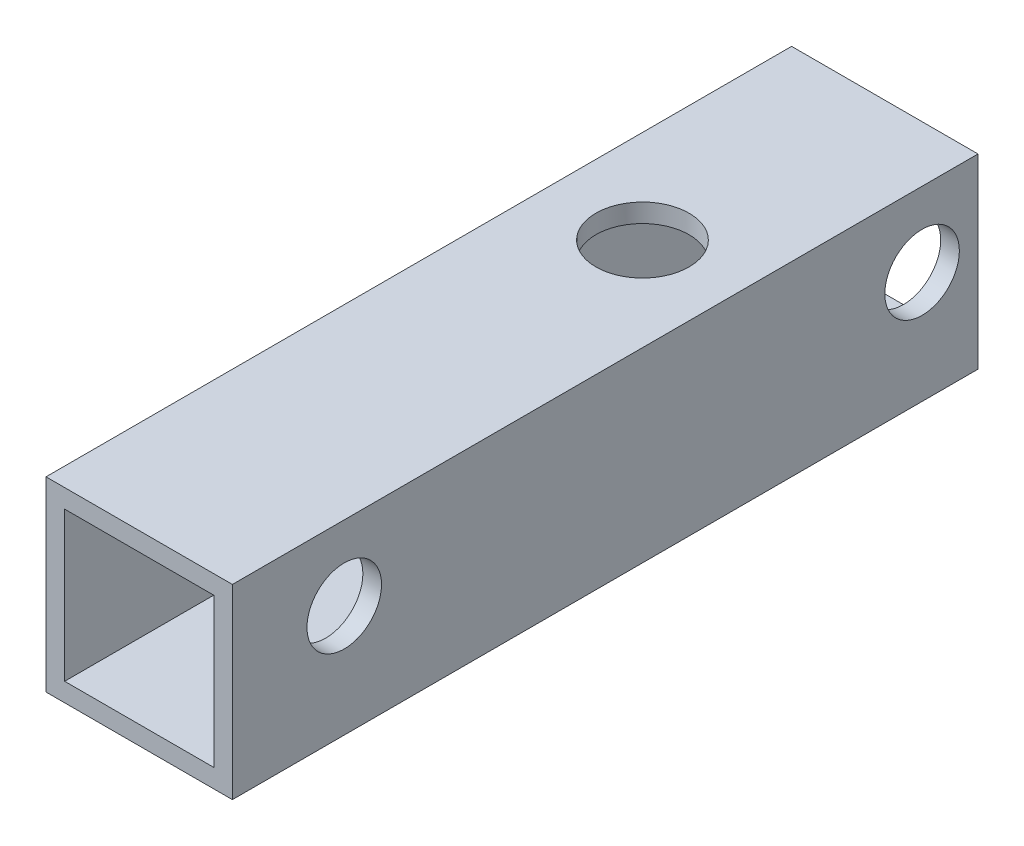
ISO-10303-21;
HEADER;
FILE_DESCRIPTION(('STEP AP214'),'2;1');
FILE_NAME('part.step','',(''),(''),'','','');
FILE_SCHEMA(('AUTOMOTIVE_DESIGN { 1 0 10303 214 1 1 1 1 }'));
ENDSEC;
DATA;
#1=APPLICATION_CONTEXT('core data for automotive mechanical design processes');
#2=APPLICATION_PROTOCOL_DEFINITION('international standard','automotive_design',2000,#1);
#3=PRODUCT_CONTEXT('',#1,'mechanical');
#4=PRODUCT('Part','Part','',(#3));
#5=PRODUCT_RELATED_PRODUCT_CATEGORY('part','',(#4));
#6=PRODUCT_DEFINITION_FORMATION('','',#4);
#7=PRODUCT_DEFINITION_CONTEXT('part definition',#1,'design');
#8=PRODUCT_DEFINITION('design','',#6,#7);
#9=PRODUCT_DEFINITION_SHAPE('','',#8);
#10=(LENGTH_UNIT() NAMED_UNIT(*) SI_UNIT(.MILLI.,.METRE.));
#11=(NAMED_UNIT(*) PLANE_ANGLE_UNIT() SI_UNIT($,.RADIAN.));
#12=(NAMED_UNIT(*) SI_UNIT($,.STERADIAN.) SOLID_ANGLE_UNIT());
#13=UNCERTAINTY_MEASURE_WITH_UNIT(LENGTH_MEASURE(1.E-05),#10,'distance_accuracy_value','');
#14=(GEOMETRIC_REPRESENTATION_CONTEXT(3) GLOBAL_UNCERTAINTY_ASSIGNED_CONTEXT((#13)) GLOBAL_UNIT_ASSIGNED_CONTEXT((#10,
#11,#12)) REPRESENTATION_CONTEXT('',''));
#15=CARTESIAN_POINT('',(0.,0.,0.));
#16=DIRECTION('',(0.,0.,1.));
#17=DIRECTION('',(1.,0.,0.));
#18=AXIS2_PLACEMENT_3D('',#15,#16,#17);
#19=CARTESIAN_POINT('',(-4.99999999999999,5.00000000000002,40.));
#20=DIRECTION('',(0.,0.,1.));
#21=DIRECTION('',(1.,0.,0.));
#22=AXIS2_PLACEMENT_3D('',#19,#20,#21);
#23=PLANE('',#22);
#24=DIRECTION('',(0.,-1.,0.));
#25=VECTOR('',#24,1.);
#26=CARTESIAN_POINT('',(-4.99999999999999,-4.99999999999999,40.));
#27=LINE('',#26,#25);
#28=CARTESIAN_POINT('',(-4.99999999999999,5.00000000000002,40.));
#29=VERTEX_POINT('',#28);
#30=CARTESIAN_POINT('',(-4.99999999999999,-4.99999999999999,40.));
#31=VERTEX_POINT('',#30);
#32=EDGE_CURVE('E138',#29,#31,#27,.T.);
#33=ORIENTED_EDGE('',*,*,#32,.T.);
#34=DIRECTION('',(1.,0.,0.));
#35=VECTOR('',#34,1.);
#36=CARTESIAN_POINT('',(5.00000000000001,-4.99999999999999,40.));
#37=LINE('',#36,#35);
#38=CARTESIAN_POINT('',(5.00000000000001,-4.99999999999999,40.));
#39=VERTEX_POINT('',#38);
#40=EDGE_CURVE('E141',#31,#39,#37,.T.);
#41=ORIENTED_EDGE('',*,*,#40,.T.);
#42=DIRECTION('',(0.,1.,0.));
#43=VECTOR('',#42,1.);
#44=CARTESIAN_POINT('',(5.00000000000001,-4.99999999999999,40.));
#45=LINE('',#44,#43);
#46=CARTESIAN_POINT('',(5.00000000000001,5.00000000000002,40.));
#47=VERTEX_POINT('',#46);
#48=EDGE_CURVE('E144',#39,#47,#45,.T.);
#49=ORIENTED_EDGE('',*,*,#48,.T.);
#50=DIRECTION('',(-1.,0.,0.));
#51=VECTOR('',#50,1.);
#52=CARTESIAN_POINT('',(5.00000000000001,5.00000000000002,40.));
#53=LINE('',#52,#51);
#54=EDGE_CURVE('E146',#47,#29,#53,.T.);
#55=ORIENTED_EDGE('',*,*,#54,.T.);
#56=EDGE_LOOP('',(#33,#41,#49,#55));
#57=FACE_BOUND('',#56,.T.);
#58=DIRECTION('',(1.,0.,0.));
#59=VECTOR('',#58,1.);
#60=CARTESIAN_POINT('',(4.00000000000001,-3.99999999999999,40.));
#61=LINE('',#60,#59);
#62=CARTESIAN_POINT('',(-3.99999999999999,-3.99999999999999,40.));
#63=VERTEX_POINT('',#62);
#64=CARTESIAN_POINT('',(4.00000000000001,-3.99999999999999,40.));
#65=VERTEX_POINT('',#64);
#66=EDGE_CURVE('E108',#63,#65,#61,.T.);
#67=ORIENTED_EDGE('',*,*,#66,.F.);
#68=DIRECTION('',(0.,-1.,0.));
#69=VECTOR('',#68,1.);
#70=CARTESIAN_POINT('',(-3.99999999999999,-3.99999999999999,40.));
#71=LINE('',#70,#69);
#72=CARTESIAN_POINT('',(-3.99999999999999,4.00000000000002,40.));
#73=VERTEX_POINT('',#72);
#74=EDGE_CURVE('E100',#73,#63,#71,.T.);
#75=ORIENTED_EDGE('',*,*,#74,.F.);
#76=DIRECTION('',(-1.,0.,0.));
#77=VECTOR('',#76,1.);
#78=CARTESIAN_POINT('',(4.00000000000001,4.00000000000002,40.));
#79=LINE('',#78,#77);
#80=CARTESIAN_POINT('',(4.00000000000002,4.00000000000002,40.));
#81=VERTEX_POINT('',#80);
#82=EDGE_CURVE('E122',#81,#73,#79,.T.);
#83=ORIENTED_EDGE('',*,*,#82,.F.);
#84=DIRECTION('',(0.,1.,0.));
#85=VECTOR('',#84,1.);
#86=CARTESIAN_POINT('',(4.00000000000001,-3.99999999999999,40.));
#87=LINE('',#86,#85);
#88=EDGE_CURVE('E120',#65,#81,#87,.T.);
#89=ORIENTED_EDGE('',*,*,#88,.F.);
#90=EDGE_LOOP('',(#67,#75,#83,#89));
#91=FACE_BOUND('',#90,.T.);
#92=ADVANCED_FACE('F33',(#57,#91),#23,.T.);
#93=CARTESIAN_POINT('',(-4.99999999999999,5.00000000000002,0.));
#94=DIRECTION('',(0.,0.,1.));
#95=DIRECTION('',(1.,0.,0.));
#96=AXIS2_PLACEMENT_3D('',#93,#94,#95);
#97=PLANE('',#96);
#98=DIRECTION('',(0.,-1.,0.));
#99=VECTOR('',#98,1.);
#100=CARTESIAN_POINT('',(-4.99999999999999,-4.99999999999999,0.));
#101=LINE('',#100,#99);
#102=CARTESIAN_POINT('',(-4.99999999999999,5.00000000000002,0.));
#103=VERTEX_POINT('',#102);
#104=CARTESIAN_POINT('',(-4.99999999999999,-4.99999999999999,0.));
#105=VERTEX_POINT('',#104);
#106=EDGE_CURVE('E116',#103,#105,#101,.T.);
#107=ORIENTED_EDGE('',*,*,#106,.F.);
#108=DIRECTION('',(-1.,0.,0.));
#109=VECTOR('',#108,1.);
#110=CARTESIAN_POINT('',(5.00000000000001,5.00000000000002,0.));
#111=LINE('',#110,#109);
#112=CARTESIAN_POINT('',(5.00000000000001,5.00000000000002,0.));
#113=VERTEX_POINT('',#112);
#114=EDGE_CURVE('E142',#113,#103,#111,.T.);
#115=ORIENTED_EDGE('',*,*,#114,.F.);
#116=DIRECTION('',(0.,1.,0.));
#117=VECTOR('',#116,1.);
#118=CARTESIAN_POINT('',(5.00000000000001,-4.99999999999999,0.));
#119=LINE('',#118,#117);
#120=CARTESIAN_POINT('',(5.00000000000001,-4.99999999999999,0.));
#121=VERTEX_POINT('',#120);
#122=EDGE_CURVE('E153',#121,#113,#119,.T.);
#123=ORIENTED_EDGE('',*,*,#122,.F.);
#124=DIRECTION('',(1.,0.,0.));
#125=VECTOR('',#124,1.);
#126=CARTESIAN_POINT('',(5.00000000000001,-4.99999999999999,0.));
#127=LINE('',#126,#125);
#128=EDGE_CURVE('E151',#105,#121,#127,.T.);
#129=ORIENTED_EDGE('',*,*,#128,.F.);
#130=EDGE_LOOP('',(#107,#115,#123,#129));
#131=FACE_BOUND('',#130,.T.);
#132=DIRECTION('',(0.,-1.,0.));
#133=VECTOR('',#132,1.);
#134=CARTESIAN_POINT('',(-3.99999999999999,-3.99999999999999,0.));
#135=LINE('',#134,#133);
#136=CARTESIAN_POINT('',(-3.99999999999999,4.00000000000002,0.));
#137=VERTEX_POINT('',#136);
#138=CARTESIAN_POINT('',(-3.99999999999999,-3.99999999999999,0.));
#139=VERTEX_POINT('',#138);
#140=EDGE_CURVE('E58',#137,#139,#135,.T.);
#141=ORIENTED_EDGE('',*,*,#140,.T.);
#142=DIRECTION('',(1.,0.,0.));
#143=VECTOR('',#142,1.);
#144=CARTESIAN_POINT('',(4.00000000000001,-3.99999999999999,0.));
#145=LINE('',#144,#143);
#146=CARTESIAN_POINT('',(4.00000000000001,-3.99999999999999,0.));
#147=VERTEX_POINT('',#146);
#148=EDGE_CURVE('E115',#139,#147,#145,.T.);
#149=ORIENTED_EDGE('',*,*,#148,.T.);
#150=DIRECTION('',(0.,1.,0.));
#151=VECTOR('',#150,1.);
#152=CARTESIAN_POINT('',(4.00000000000001,-3.99999999999999,0.));
#153=LINE('',#152,#151);
#154=CARTESIAN_POINT('',(4.00000000000001,4.00000000000002,0.));
#155=VERTEX_POINT('',#154);
#156=EDGE_CURVE('E130',#147,#155,#153,.T.);
#157=ORIENTED_EDGE('',*,*,#156,.T.);
#158=DIRECTION('',(-1.,0.,0.));
#159=VECTOR('',#158,1.);
#160=CARTESIAN_POINT('',(4.00000000000001,4.00000000000002,0.));
#161=LINE('',#160,#159);
#162=EDGE_CURVE('E109',#155,#137,#161,.T.);
#163=ORIENTED_EDGE('',*,*,#162,.T.);
#164=EDGE_LOOP('',(#141,#149,#157,#163));
#165=FACE_BOUND('',#164,.T.);
#166=ADVANCED_FACE('F212',(#131,#165),#97,.F.);
#167=CARTESIAN_POINT('',(-4.99999999999999,-4.99999999999999,40.));
#168=DIRECTION('',(1.,0.,0.));
#169=DIRECTION('',(0.,0.,-1.));
#170=AXIS2_PLACEMENT_3D('',#167,#168,#169);
#171=PLANE('',#170);
#172=CARTESIAN_POINT('',(-4.99999999999999,1.00000000000001,3.));
#173=DIRECTION('',(1.,0.,0.));
#174=DIRECTION('',(0.,0.,-1.));
#175=AXIS2_PLACEMENT_3D('',#172,#173,#174);
#176=CIRCLE('',#175,2.);
#177=CARTESIAN_POINT('',(-4.99999999999999,1.00000000000001,1.));
#178=VERTEX_POINT('',#177);
#179=EDGE_CURVE('E169',#178,#178,#176,.T.);
#180=ORIENTED_EDGE('',*,*,#179,.T.);
#181=EDGE_LOOP('',(#180));
#182=FACE_BOUND('',#181,.T.);
#183=CARTESIAN_POINT('',(-4.99999999999999,1.00000000000001,34.));
#184=DIRECTION('',(1.,0.,0.));
#185=DIRECTION('',(0.,0.,-1.));
#186=AXIS2_PLACEMENT_3D('',#183,#184,#185);
#187=CIRCLE('',#186,2.);
#188=CARTESIAN_POINT('',(-4.99999999999999,1.00000000000001,32.));
#189=VERTEX_POINT('',#188);
#190=EDGE_CURVE('E165',#189,#189,#187,.T.);
#191=ORIENTED_EDGE('',*,*,#190,.T.);
#192=EDGE_LOOP('',(#191));
#193=FACE_BOUND('',#192,.T.);
#194=ORIENTED_EDGE('',*,*,#106,.T.);
#195=DIRECTION('',(0.,0.,-1.));
#196=VECTOR('',#195,1.);
#197=CARTESIAN_POINT('',(-4.99999999999999,-4.99999999999999,40.));
#198=LINE('',#197,#196);
#199=EDGE_CURVE('E11',#31,#105,#198,.T.);
#200=ORIENTED_EDGE('',*,*,#199,.F.);
#201=ORIENTED_EDGE('',*,*,#32,.F.);
#202=DIRECTION('',(0.,0.,-1.));
#203=VECTOR('',#202,1.);
#204=CARTESIAN_POINT('',(-4.99999999999999,5.00000000000002,40.));
#205=LINE('',#204,#203);
#206=EDGE_CURVE('E148',#29,#103,#205,.T.);
#207=ORIENTED_EDGE('',*,*,#206,.T.);
#208=EDGE_LOOP('',(#194,#200,#201,#207));
#209=FACE_BOUND('',#208,.T.);
#210=ADVANCED_FACE('F35',(#182,#193,#209),#171,.F.);
#211=CARTESIAN_POINT('',(5.00000000000001,-4.99999999999999,40.));
#212=DIRECTION('',(0.,1.,0.));
#213=DIRECTION('',(0.,0.,1.));
#214=AXIS2_PLACEMENT_3D('',#211,#212,#213);
#215=PLANE('',#214);
#216=CARTESIAN_POINT('',(0.,-4.99999999999999,13.));
#217=DIRECTION('',(0.,1.,0.));
#218=DIRECTION('',(0.,0.,1.));
#219=AXIS2_PLACEMENT_3D('',#216,#217,#218);
#220=CIRCLE('',#219,2.5);
#221=CARTESIAN_POINT('',(0.,-4.99999999999999,15.5));
#222=VERTEX_POINT('',#221);
#223=EDGE_CURVE('E181',#222,#222,#220,.T.);
#224=ORIENTED_EDGE('',*,*,#223,.T.);
#225=EDGE_LOOP('',(#224));
#226=FACE_BOUND('',#225,.T.);
#227=ORIENTED_EDGE('',*,*,#128,.T.);
#228=DIRECTION('',(0.,0.,-1.));
#229=VECTOR('',#228,1.);
#230=CARTESIAN_POINT('',(5.00000000000001,-4.99999999999999,40.));
#231=LINE('',#230,#229);
#232=EDGE_CURVE('E42',#39,#121,#231,.T.);
#233=ORIENTED_EDGE('',*,*,#232,.F.);
#234=ORIENTED_EDGE('',*,*,#40,.F.);
#235=ORIENTED_EDGE('',*,*,#199,.T.);
#236=EDGE_LOOP('',(#227,#233,#234,#235));
#237=FACE_BOUND('',#236,.T.);
#238=ADVANCED_FACE('F221',(#226,#237),#215,.F.);
#239=CARTESIAN_POINT('',(5.00000000000001,-4.99999999999999,40.));
#240=DIRECTION('',(-1.,0.,0.));
#241=DIRECTION('',(0.,0.,1.));
#242=AXIS2_PLACEMENT_3D('',#239,#240,#241);
#243=PLANE('',#242);
#244=CARTESIAN_POINT('',(5.00000000000001,1.00000000000001,3.));
#245=DIRECTION('',(1.,0.,0.));
#246=DIRECTION('',(0.,0.,-1.));
#247=AXIS2_PLACEMENT_3D('',#244,#245,#246);
#248=CIRCLE('',#247,2.);
#249=CARTESIAN_POINT('',(5.00000000000001,1.00000000000001,1.));
#250=VERTEX_POINT('',#249);
#251=EDGE_CURVE('E176',#250,#250,#248,.T.);
#252=ORIENTED_EDGE('',*,*,#251,.F.);
#253=EDGE_LOOP('',(#252));
#254=FACE_BOUND('',#253,.T.);
#255=CARTESIAN_POINT('',(5.00000000000001,1.00000000000001,34.));
#256=DIRECTION('',(1.,0.,0.));
#257=DIRECTION('',(0.,0.,-1.));
#258=AXIS2_PLACEMENT_3D('',#255,#256,#257);
#259=CIRCLE('',#258,2.);
#260=CARTESIAN_POINT('',(5.00000000000001,1.00000000000001,32.));
#261=VERTEX_POINT('',#260);
#262=EDGE_CURVE('E173',#261,#261,#259,.T.);
#263=ORIENTED_EDGE('',*,*,#262,.F.);
#264=EDGE_LOOP('',(#263));
#265=FACE_BOUND('',#264,.T.);
#266=ORIENTED_EDGE('',*,*,#122,.T.);
#267=DIRECTION('',(0.,0.,-1.));
#268=VECTOR('',#267,1.);
#269=CARTESIAN_POINT('',(5.00000000000001,5.00000000000002,40.));
#270=LINE('',#269,#268);
#271=EDGE_CURVE('E158',#47,#113,#270,.T.);
#272=ORIENTED_EDGE('',*,*,#271,.F.);
#273=ORIENTED_EDGE('',*,*,#48,.F.);
#274=ORIENTED_EDGE('',*,*,#232,.T.);
#275=EDGE_LOOP('',(#266,#272,#273,#274));
#276=FACE_BOUND('',#275,.T.);
#277=ADVANCED_FACE('F206',(#254,#265,#276),#243,.F.);
#278=CARTESIAN_POINT('',(5.00000000000001,5.00000000000002,40.));
#279=DIRECTION('',(0.,-1.,0.));
#280=DIRECTION('',(0.,0.,-1.));
#281=AXIS2_PLACEMENT_3D('',#278,#279,#280);
#282=PLANE('',#281);
#283=CARTESIAN_POINT('',(0.,5.00000000000002,13.));
#284=DIRECTION('',(0.,1.,0.));
#285=DIRECTION('',(0.,0.,1.));
#286=AXIS2_PLACEMENT_3D('',#283,#284,#285);
#287=CIRCLE('',#286,2.5);
#288=CARTESIAN_POINT('',(0.,5.00000000000002,15.5));
#289=VERTEX_POINT('',#288);
#290=EDGE_CURVE('E279',#289,#289,#287,.T.);
#291=ORIENTED_EDGE('',*,*,#290,.F.);
#292=EDGE_LOOP('',(#291));
#293=FACE_BOUND('',#292,.T.);
#294=ORIENTED_EDGE('',*,*,#114,.T.);
#295=ORIENTED_EDGE('',*,*,#206,.F.);
#296=ORIENTED_EDGE('',*,*,#54,.F.);
#297=ORIENTED_EDGE('',*,*,#271,.T.);
#298=EDGE_LOOP('',(#294,#295,#296,#297));
#299=FACE_BOUND('',#298,.T.);
#300=ADVANCED_FACE('F196',(#293,#299),#282,.F.);
#301=CARTESIAN_POINT('',(-3.99999999999999,-3.99999999999999,40.));
#302=DIRECTION('',(1.,0.,0.));
#303=DIRECTION('',(0.,1.,0.));
#304=AXIS2_PLACEMENT_3D('',#301,#302,#303);
#305=PLANE('',#304);
#306=CARTESIAN_POINT('',(-3.99999999999999,1.00000000000001,3.));
#307=DIRECTION('',(1.,0.,0.));
#308=DIRECTION('',(0.,1.,0.));
#309=AXIS2_PLACEMENT_3D('',#306,#307,#308);
#310=CIRCLE('',#309,2.);
#311=CARTESIAN_POINT('',(-3.99999999999999,3.00000000000001,3.));
#312=VERTEX_POINT('',#311);
#313=EDGE_CURVE('E168',#312,#312,#310,.T.);
#314=ORIENTED_EDGE('',*,*,#313,.F.);
#315=EDGE_LOOP('',(#314));
#316=FACE_BOUND('',#315,.T.);
#317=CARTESIAN_POINT('',(-3.99999999999999,1.00000000000001,34.));
#318=DIRECTION('',(1.,0.,0.));
#319=DIRECTION('',(0.,1.,0.));
#320=AXIS2_PLACEMENT_3D('',#317,#318,#319);
#321=CIRCLE('',#320,2.);
#322=CARTESIAN_POINT('',(-3.99999999999999,3.00000000000001,34.));
#323=VERTEX_POINT('',#322);
#324=EDGE_CURVE('E128',#323,#323,#321,.T.);
#325=ORIENTED_EDGE('',*,*,#324,.F.);
#326=EDGE_LOOP('',(#325));
#327=FACE_BOUND('',#326,.T.);
#328=ORIENTED_EDGE('',*,*,#140,.F.);
#329=DIRECTION('',(0.,0.,-1.));
#330=VECTOR('',#329,1.);
#331=CARTESIAN_POINT('',(-3.99999999999999,4.00000000000002,40.));
#332=LINE('',#331,#330);
#333=EDGE_CURVE('E104',#73,#137,#332,.T.);
#334=ORIENTED_EDGE('',*,*,#333,.F.);
#335=ORIENTED_EDGE('',*,*,#74,.T.);
#336=DIRECTION('',(0.,0.,-1.));
#337=VECTOR('',#336,1.);
#338=CARTESIAN_POINT('',(-3.99999999999999,-3.99999999999999,40.));
#339=LINE('',#338,#337);
#340=EDGE_CURVE('E103',#63,#139,#339,.T.);
#341=ORIENTED_EDGE('',*,*,#340,.T.);
#342=EDGE_LOOP('',(#328,#334,#335,#341));
#343=FACE_BOUND('',#342,.T.);
#344=ADVANCED_FACE('F102',(#316,#327,#343),#305,.T.);
#345=CARTESIAN_POINT('',(4.00000000000001,-3.99999999999999,40.));
#346=DIRECTION('',(0.,1.,0.));
#347=DIRECTION('',(-1.,0.,0.));
#348=AXIS2_PLACEMENT_3D('',#345,#346,#347);
#349=PLANE('',#348);
#350=CARTESIAN_POINT('',(0.,-3.99999999999999,13.));
#351=DIRECTION('',(0.,1.,0.));
#352=DIRECTION('',(-1.,0.,0.));
#353=AXIS2_PLACEMENT_3D('',#350,#351,#352);
#354=CIRCLE('',#353,2.5);
#355=CARTESIAN_POINT('',(-2.49999999999999,-3.99999999999999,13.));
#356=VERTEX_POINT('',#355);
#357=EDGE_CURVE('E281',#356,#356,#354,.T.);
#358=ORIENTED_EDGE('',*,*,#357,.F.);
#359=EDGE_LOOP('',(#358));
#360=FACE_BOUND('',#359,.T.);
#361=ORIENTED_EDGE('',*,*,#148,.F.);
#362=ORIENTED_EDGE('',*,*,#340,.F.);
#363=ORIENTED_EDGE('',*,*,#66,.T.);
#364=DIRECTION('',(0.,0.,-1.));
#365=VECTOR('',#364,1.);
#366=CARTESIAN_POINT('',(4.00000000000001,-3.99999999999999,40.));
#367=LINE('',#366,#365);
#368=EDGE_CURVE('E117',#65,#147,#367,.T.);
#369=ORIENTED_EDGE('',*,*,#368,.T.);
#370=EDGE_LOOP('',(#361,#362,#363,#369));
#371=FACE_BOUND('',#370,.T.);
#372=ADVANCED_FACE('F112',(#360,#371),#349,.T.);
#373=CARTESIAN_POINT('',(4.00000000000001,-3.99999999999999,40.));
#374=DIRECTION('',(-1.,0.,0.));
#375=DIRECTION('',(0.,0.,1.));
#376=AXIS2_PLACEMENT_3D('',#373,#374,#375);
#377=PLANE('',#376);
#378=CARTESIAN_POINT('',(4.00000000000001,1.00000000000001,3.));
#379=DIRECTION('',(-1.,0.,0.));
#380=DIRECTION('',(0.,0.,1.));
#381=AXIS2_PLACEMENT_3D('',#378,#379,#380);
#382=CIRCLE('',#381,2.);
#383=CARTESIAN_POINT('',(4.00000000000001,1.00000000000001,5.));
#384=VERTEX_POINT('',#383);
#385=EDGE_CURVE('E166',#384,#384,#382,.T.);
#386=ORIENTED_EDGE('',*,*,#385,.F.);
#387=EDGE_LOOP('',(#386));
#388=FACE_BOUND('',#387,.T.);
#389=CARTESIAN_POINT('',(4.00000000000001,1.00000000000001,34.));
#390=DIRECTION('',(-1.,0.,0.));
#391=DIRECTION('',(0.,0.,1.));
#392=AXIS2_PLACEMENT_3D('',#389,#390,#391);
#393=CIRCLE('',#392,2.);
#394=CARTESIAN_POINT('',(4.00000000000001,1.00000000000001,36.));
#395=VERTEX_POINT('',#394);
#396=EDGE_CURVE('E163',#395,#395,#393,.T.);
#397=ORIENTED_EDGE('',*,*,#396,.F.);
#398=EDGE_LOOP('',(#397));
#399=FACE_BOUND('',#398,.T.);
#400=ORIENTED_EDGE('',*,*,#156,.F.);
#401=ORIENTED_EDGE('',*,*,#368,.F.);
#402=ORIENTED_EDGE('',*,*,#88,.T.);
#403=DIRECTION('',(0.,0.,-1.));
#404=VECTOR('',#403,1.);
#405=CARTESIAN_POINT('',(4.00000000000001,4.00000000000002,40.));
#406=LINE('',#405,#404);
#407=EDGE_CURVE('E50',#81,#155,#406,.T.);
#408=ORIENTED_EDGE('',*,*,#407,.T.);
#409=EDGE_LOOP('',(#400,#401,#402,#408));
#410=FACE_BOUND('',#409,.T.);
#411=ADVANCED_FACE('F203',(#388,#399,#410),#377,.T.);
#412=CARTESIAN_POINT('',(4.00000000000001,4.00000000000002,40.));
#413=DIRECTION('',(0.,-1.,0.));
#414=DIRECTION('',(1.,0.,0.));
#415=AXIS2_PLACEMENT_3D('',#412,#413,#414);
#416=PLANE('',#415);
#417=CARTESIAN_POINT('',(0.,4.00000000000002,13.));
#418=DIRECTION('',(0.,-1.,0.));
#419=DIRECTION('',(1.,0.,0.));
#420=AXIS2_PLACEMENT_3D('',#417,#418,#419);
#421=CIRCLE('',#420,2.5);
#422=CARTESIAN_POINT('',(2.50000000000001,4.00000000000002,13.));
#423=VERTEX_POINT('',#422);
#424=EDGE_CURVE('E37',#423,#423,#421,.T.);
#425=ORIENTED_EDGE('',*,*,#424,.F.);
#426=EDGE_LOOP('',(#425));
#427=FACE_BOUND('',#426,.T.);
#428=ORIENTED_EDGE('',*,*,#162,.F.);
#429=ORIENTED_EDGE('',*,*,#407,.F.);
#430=ORIENTED_EDGE('',*,*,#82,.T.);
#431=ORIENTED_EDGE('',*,*,#333,.T.);
#432=EDGE_LOOP('',(#428,#429,#430,#431));
#433=FACE_BOUND('',#432,.T.);
#434=ADVANCED_FACE('F246',(#427,#433),#416,.T.);
#435=CARTESIAN_POINT('',(-4.99999999999999,1.00000000000001,34.));
#436=DIRECTION('',(1.,0.,0.));
#437=DIRECTION('',(0.,0.,-1.));
#438=AXIS2_PLACEMENT_3D('',#435,#436,#437);
#439=CYLINDRICAL_SURFACE('',#438,2.);
#440=ORIENTED_EDGE('',*,*,#396,.T.);
#441=EDGE_LOOP('',(#440));
#442=FACE_BOUND('',#441,.T.);
#443=ORIENTED_EDGE('',*,*,#262,.T.);
#444=EDGE_LOOP('',(#443));
#445=FACE_BOUND('',#444,.T.);
#446=ADVANCED_FACE('F248',(#442,#445),#439,.F.);
#447=ORIENTED_EDGE('',*,*,#324,.T.);
#448=EDGE_LOOP('',(#447));
#449=FACE_BOUND('',#448,.T.);
#450=ORIENTED_EDGE('',*,*,#190,.F.);
#451=EDGE_LOOP('',(#450));
#452=FACE_BOUND('',#451,.T.);
#453=ADVANCED_FACE('F192',(#449,#452),#439,.F.);
#454=CARTESIAN_POINT('',(-4.99999999999999,1.00000000000001,3.));
#455=DIRECTION('',(1.,0.,0.));
#456=DIRECTION('',(0.,0.,-1.));
#457=AXIS2_PLACEMENT_3D('',#454,#455,#456);
#458=CYLINDRICAL_SURFACE('',#457,2.);
#459=ORIENTED_EDGE('',*,*,#385,.T.);
#460=EDGE_LOOP('',(#459));
#461=FACE_BOUND('',#460,.T.);
#462=ORIENTED_EDGE('',*,*,#251,.T.);
#463=EDGE_LOOP('',(#462));
#464=FACE_BOUND('',#463,.T.);
#465=ADVANCED_FACE('F261',(#461,#464),#458,.F.);
#466=ORIENTED_EDGE('',*,*,#313,.T.);
#467=EDGE_LOOP('',(#466));
#468=FACE_BOUND('',#467,.T.);
#469=ORIENTED_EDGE('',*,*,#179,.F.);
#470=EDGE_LOOP('',(#469));
#471=FACE_BOUND('',#470,.T.);
#472=ADVANCED_FACE('F264',(#468,#471),#458,.F.);
#473=CARTESIAN_POINT('',(0.,-12.,13.));
#474=DIRECTION('',(0.,1.,0.));
#475=DIRECTION('',(0.,0.,1.));
#476=AXIS2_PLACEMENT_3D('',#473,#474,#475);
#477=CYLINDRICAL_SURFACE('',#476,2.5);
#478=ORIENTED_EDGE('',*,*,#424,.T.);
#479=EDGE_LOOP('',(#478));
#480=FACE_BOUND('',#479,.T.);
#481=ORIENTED_EDGE('',*,*,#290,.T.);
#482=EDGE_LOOP('',(#481));
#483=FACE_BOUND('',#482,.T.);
#484=ADVANCED_FACE('F265',(#480,#483),#477,.F.);
#485=ORIENTED_EDGE('',*,*,#357,.T.);
#486=EDGE_LOOP('',(#485));
#487=FACE_BOUND('',#486,.T.);
#488=ORIENTED_EDGE('',*,*,#223,.F.);
#489=EDGE_LOOP('',(#488));
#490=FACE_BOUND('',#489,.T.);
#491=ADVANCED_FACE('F267',(#487,#490),#477,.F.);
#492=CLOSED_SHELL('',(#92,#166,#210,#238,#277,#300,#344,#372,#411,#434,#446,#453,#465,#472,#484,#491));
#493=MANIFOLD_SOLID_BREP('B2',#492);
#494=ADVANCED_BREP_SHAPE_REPRESENTATION('',(#18,#493),#14);
#495=SHAPE_DEFINITION_REPRESENTATION(#9,#494);
ENDSEC;
END-ISO-10303-21;
